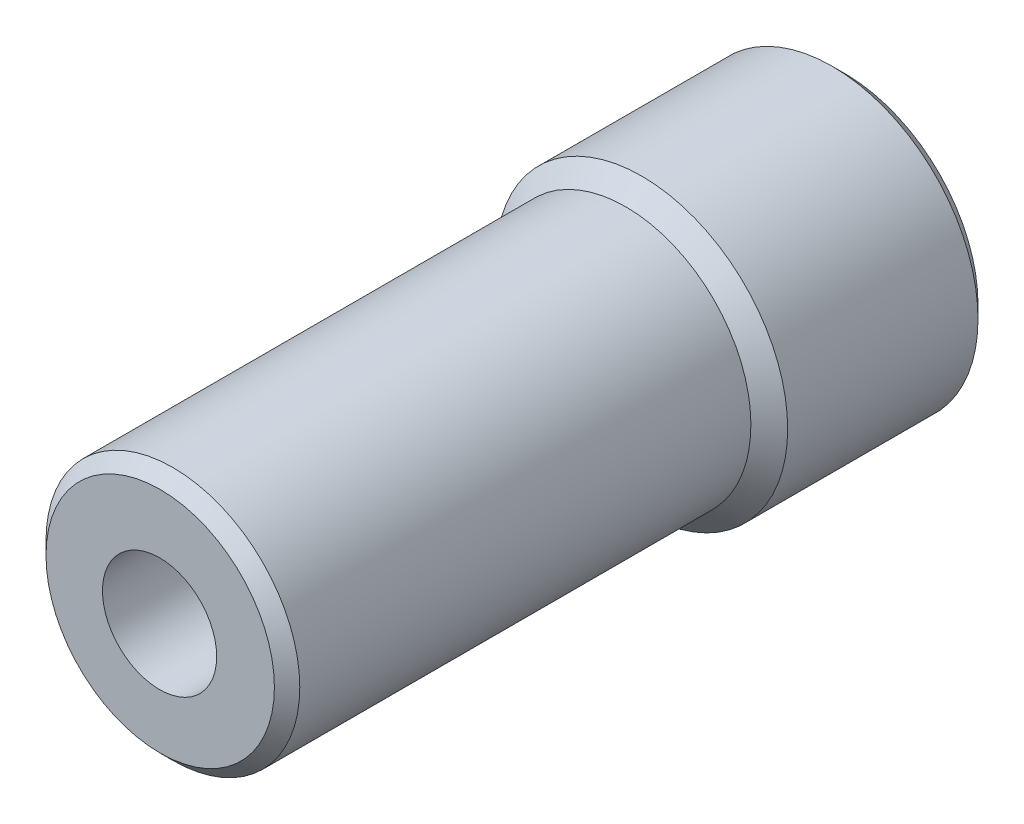
ISO-10303-21;
HEADER;
FILE_DESCRIPTION(('STEP AP214'),'2;1');
FILE_NAME('part.step','',(''),(''),'','','');
FILE_SCHEMA(('AUTOMOTIVE_DESIGN { 1 0 10303 214 1 1 1 1 }'));
ENDSEC;
DATA;
#1=APPLICATION_CONTEXT('core data for automotive mechanical design processes');
#2=APPLICATION_PROTOCOL_DEFINITION('international standard','automotive_design',2000,#1);
#3=PRODUCT_CONTEXT('',#1,'mechanical');
#4=PRODUCT('Part','Part','',(#3));
#5=PRODUCT_RELATED_PRODUCT_CATEGORY('part','',(#4));
#6=PRODUCT_DEFINITION_FORMATION('','',#4);
#7=PRODUCT_DEFINITION_CONTEXT('part definition',#1,'design');
#8=PRODUCT_DEFINITION('design','',#6,#7);
#9=PRODUCT_DEFINITION_SHAPE('','',#8);
#10=(LENGTH_UNIT() NAMED_UNIT(*) SI_UNIT(.MILLI.,.METRE.));
#11=(NAMED_UNIT(*) PLANE_ANGLE_UNIT() SI_UNIT($,.RADIAN.));
#12=(NAMED_UNIT(*) SI_UNIT($,.STERADIAN.) SOLID_ANGLE_UNIT());
#13=UNCERTAINTY_MEASURE_WITH_UNIT(LENGTH_MEASURE(1.E-05),#10,'distance_accuracy_value','');
#14=(GEOMETRIC_REPRESENTATION_CONTEXT(3) GLOBAL_UNCERTAINTY_ASSIGNED_CONTEXT((#13)) GLOBAL_UNIT_ASSIGNED_CONTEXT((#10,
#11,#12)) REPRESENTATION_CONTEXT('',''));
#15=CARTESIAN_POINT('',(0.,0.,0.));
#16=DIRECTION('',(0.,0.,1.));
#17=DIRECTION('',(1.,0.,0.));
#18=AXIS2_PLACEMENT_3D('',#15,#16,#17);
#19=CARTESIAN_POINT('',(0.,-0.0682544576997889,10.));
#20=DIRECTION('',(0.,0.,-1.));
#21=DIRECTION('',(-1.,0.,0.));
#22=AXIS2_PLACEMENT_3D('',#19,#20,#21);
#23=CYLINDRICAL_SURFACE('',#22,5.75);
#24=CARTESIAN_POINT('',(0.,-0.0682544576997889,0.500000000000009));
#25=DIRECTION('',(0.,0.,1.));
#26=DIRECTION('',(1.,0.,0.));
#27=AXIS2_PLACEMENT_3D('',#24,#25,#26);
#28=CIRCLE('',#27,5.75);
#29=CARTESIAN_POINT('',(5.75,-0.0682544576997889,0.500000000000009));
#30=VERTEX_POINT('',#29);
#31=EDGE_CURVE('E61',#30,#30,#28,.T.);
#32=ORIENTED_EDGE('',*,*,#31,.T.);
#33=EDGE_LOOP('',(#32));
#34=FACE_BOUND('',#33,.T.);
#35=CARTESIAN_POINT('',(0.,-0.0682544576997889,7.99999999999999));
#36=DIRECTION('',(0.,0.,1.));
#37=DIRECTION('',(1.,0.,0.));
#38=AXIS2_PLACEMENT_3D('',#35,#36,#37);
#39=CIRCLE('',#38,5.75);
#40=CARTESIAN_POINT('',(5.75,-0.0682544576997889,7.99999999999999));
#41=VERTEX_POINT('',#40);
#42=EDGE_CURVE('E90',#41,#41,#39,.F.);
#43=ORIENTED_EDGE('',*,*,#42,.T.);
#44=EDGE_LOOP('',(#43));
#45=FACE_BOUND('',#44,.T.);
#46=ADVANCED_FACE('F52',(#34,#45),#23,.T.);
#47=CARTESIAN_POINT('',(0.,-0.0682544576997889,0.));
#48=DIRECTION('',(0.,0.,1.));
#49=DIRECTION('',(1.,0.,0.));
#50=AXIS2_PLACEMENT_3D('',#47,#48,#49);
#51=PLANE('',#50);
#52=CARTESIAN_POINT('',(0.,-0.0682544576997889,0.));
#53=DIRECTION('',(0.,0.,1.));
#54=DIRECTION('',(1.,0.,0.));
#55=AXIS2_PLACEMENT_3D('',#52,#53,#54);
#56=CIRCLE('',#55,5.24999999999999);
#57=CARTESIAN_POINT('',(5.24999999999999,-0.0682544576997889,0.));
#58=VERTEX_POINT('',#57);
#59=EDGE_CURVE('E10',#58,#58,#56,.F.);
#60=ORIENTED_EDGE('',*,*,#59,.T.);
#61=EDGE_LOOP('',(#60));
#62=FACE_BOUND('',#61,.T.);
#63=CARTESIAN_POINT('',(0.,0.,0.));
#64=DIRECTION('',(0.,0.,-1.));
#65=DIRECTION('',(-1.,0.,0.));
#66=AXIS2_PLACEMENT_3D('',#63,#64,#65);
#67=CIRCLE('',#66,2.5);
#68=CARTESIAN_POINT('',(-2.5,0.,0.));
#69=VERTEX_POINT('',#68);
#70=EDGE_CURVE('E130',#69,#69,#67,.T.);
#71=ORIENTED_EDGE('',*,*,#70,.F.);
#72=EDGE_LOOP('',(#71));
#73=FACE_BOUND('',#72,.T.);
#74=ADVANCED_FACE('F118',(#62,#73),#51,.F.);
#75=CARTESIAN_POINT('',(0.0248752201066661,0.,27.));
#76=DIRECTION('',(0.,0.,-1.));
#77=DIRECTION('',(-1.,0.,0.));
#78=AXIS2_PLACEMENT_3D('',#75,#76,#77);
#79=CYLINDRICAL_SURFACE('',#78,5.);
#80=CARTESIAN_POINT('',(0.0248752201066661,0.,26.5));
#81=DIRECTION('',(0.,0.,1.));
#82=DIRECTION('',(1.,0.,0.));
#83=AXIS2_PLACEMENT_3D('',#80,#81,#82);
#84=CIRCLE('',#83,5.);
#85=CARTESIAN_POINT('',(5.02487522010667,0.,26.5));
#86=VERTEX_POINT('',#85);
#87=EDGE_CURVE('E68',#86,#86,#84,.F.);
#88=ORIENTED_EDGE('',*,*,#87,.T.);
#89=EDGE_LOOP('',(#88));
#90=FACE_BOUND('',#89,.T.);
#91=CARTESIAN_POINT('',(-4.97509659122163,-0.0167894586709536,8.77463722547689));
#92=CARTESIAN_POINT('',(-4.97426558216171,-0.263097965769824,8.7780120522872));
#93=CARTESIAN_POINT('',(-4.95519980123096,-0.509400106208778,8.78129907887567));
#94=CARTESIAN_POINT('',(-4.88099142621974,-0.996640213691707,8.78762474432996));
#95=CARTESIAN_POINT('',(-4.82582250819701,-1.23757413394767,8.79066320013493));
#96=CARTESIAN_POINT('',(-4.67034754283656,-1.74178397826683,8.79682629194088));
#97=CARTESIAN_POINT('',(-4.56480199576196,-2.00346302667188,8.79990339789837));
#98=CARTESIAN_POINT('',(-4.31125429318877,-2.5054142457431,8.80555364803044));
#99=CARTESIAN_POINT('',(-4.16324186462972,-2.74568121821169,8.80812667000952));
#100=CARTESIAN_POINT('',(-3.82899785990766,-3.19791989547926,8.812692412257));
#101=CARTESIAN_POINT('',(-3.6427734729016,-3.40989691035764,8.81468524151189));
#102=CARTESIAN_POINT('',(-3.23738705315629,-3.7995645119135,8.81803215236399));
#103=CARTESIAN_POINT('',(-3.01822684163031,-3.9772569931422,8.81938626926219));
#104=CARTESIAN_POINT('',(-2.55320013210684,-4.29331520481402,8.82141579137134));
#105=CARTESIAN_POINT('',(-2.3073356749734,-4.43168393764401,8.82209124840827));
#106=CARTESIAN_POINT('',(-1.79586387963108,-4.66518400360695,8.82274358519057));
#107=CARTESIAN_POINT('',(-1.53025634670667,-4.76031491024219,8.82272045804526));
#108=CARTESIAN_POINT('',(-0.986857106936146,-4.90463256766433,8.82197632096218));
#109=CARTESIAN_POINT('',(-0.709066103931216,-4.95382196884933,8.82125535128834));
#110=CARTESIAN_POINT('',(-0.149171733652034,-5.00487058024485,8.81913697295311));
#111=CARTESIAN_POINT('',(0.132931628132189,-5.00672985070596,8.81773956515282));
#112=CARTESIAN_POINT('',(0.693448329180573,-4.96306686704079,8.81430964263027));
#113=CARTESIAN_POINT('',(0.971861604639036,-4.91754379470072,8.81227711694099));
#114=CARTESIAN_POINT('',(1.51709112312577,-4.78040919551343,8.80763692812686));
#115=CARTESIAN_POINT('',(1.78390736317334,-4.68879765682051,8.80502926485418));
#116=CARTESIAN_POINT('',(2.29839144678519,-4.46207954955437,8.79931516016538));
#117=CARTESIAN_POINT('',(2.54605778128617,-4.32696955751106,8.79620867950037));
#118=CARTESIAN_POINT('',(3.01519073055738,-4.01709354186784,8.78958783794881));
#119=CARTESIAN_POINT('',(3.23665732677767,-3.84232749019089,8.78607347677348));
#120=CARTESIAN_POINT('',(3.64712860458447,-3.4580806426861,8.77873851563791));
#121=CARTESIAN_POINT('',(3.83612987831957,-3.24859620703454,8.77491788359038));
#122=CARTESIAN_POINT('',(4.17627900894536,-2.80087240232264,8.76708088528563));
#123=CARTESIAN_POINT('',(4.32742684851719,-2.56263302010628,8.76306451893885));
#124=CARTESIAN_POINT('',(4.5875911053579,-2.06414036009741,8.75495070441226));
#125=CARTESIAN_POINT('',(4.69660397986469,-1.8038852334342,8.75085324944484));
#126=CARTESIAN_POINT('',(4.86938601492586,-1.26876585966112,8.74269405901394));
#127=CARTESIAN_POINT('',(4.93315516358512,-0.993901608710351,8.73863232355984));
#128=CARTESIAN_POINT('',(5.01363999134612,-0.437358645376182,8.73065908316804));
#129=CARTESIAN_POINT('',(5.03035442111815,-0.155679752260397,8.72674758222186));
#130=CARTESIAN_POINT('',(5.0162502589587,0.406489056160449,8.7191845345419));
#131=CARTESIAN_POINT('',(4.98543167239235,0.686978971599709,8.71553298777877));
#132=CARTESIAN_POINT('',(4.87713665430119,1.23879493177218,8.70859164463336));
#133=CARTESIAN_POINT('',(4.79966214399957,1.51012135335892,8.70530183336193));
#134=CARTESIAN_POINT('',(4.60025414653651,2.0359184901085,8.6991748205948));
#135=CARTESIAN_POINT('',(4.47832068232888,2.29038921397372,8.69633761886542));
#136=CARTESIAN_POINT('',(4.19346754684805,2.7752266781282,8.69119415602358));
#137=CARTESIAN_POINT('',(4.03055155960642,3.00559558236211,8.68888784722337));
#138=CARTESIAN_POINT('',(3.66835146280358,3.43571366143873,8.68486904469479));
#139=CARTESIAN_POINT('',(3.46906736448947,3.63546284575077,8.68315655078278));
#140=CARTESIAN_POINT('',(3.03980954442973,3.9986504139556,8.68037228796258));
#141=CARTESIAN_POINT('',(2.80983885958685,4.16209238673738,8.67930045570865));
#142=CARTESIAN_POINT('',(2.3257211050865,4.44804939379749,8.67782645293081));
#143=CARTESIAN_POINT('',(2.07157406157901,4.57056447234311,8.67742428168258));
#144=CARTESIAN_POINT('',(1.54633634518542,4.7711823907143,8.67730054645108));
#145=CARTESIAN_POINT('',(1.27524679858137,4.84928817924572,8.67757893727307));
#146=CARTESIAN_POINT('',(0.723804271168122,4.95888326377515,8.67880865833074));
#147=CARTESIAN_POINT('',(0.443451281503609,4.99037251520916,8.67975998920973));
#148=CARTESIAN_POINT('',(-0.118557470405511,5.00584157440802,8.68230967541688));
#149=CARTESIAN_POINT('',(-0.400213223942635,4.9898216992601,8.68390802642662));
#150=CARTESIAN_POINT('',(-0.956835120396729,4.91072965810285,8.68770813764293));
#151=CARTESIAN_POINT('',(-1.23180125308225,4.84765742013388,8.68990989877232));
#152=CARTESIAN_POINT('',(-1.76725829835297,4.67624711714684,8.69485672431702));
#153=CARTESIAN_POINT('',(-2.02774821023362,4.56790592719961,8.69760182623241));
#154=CARTESIAN_POINT('',(-2.5268336253897,4.30903748220511,8.70355970051687));
#155=CARTESIAN_POINT('',(-2.76542965105565,4.15851123404557,8.70677246172281));
#156=CARTESIAN_POINT('',(-3.21397145114571,3.81954189180354,8.71357701546597));
#157=CARTESIAN_POINT('',(-3.4239163129284,3.63109759036917,8.71716882007061));
#158=CARTESIAN_POINT('',(-3.80922080353364,3.2216061706186,8.72463221678149));
#159=CARTESIAN_POINT('',(-3.98457510190472,3.00055403655152,8.72850385188456));
#160=CARTESIAN_POINT('',(-4.29573961869831,2.53207774668243,8.73641926246862));
#161=CARTESIAN_POINT('',(-4.43153445563773,2.28464338390281,8.7404631042083));
#162=CARTESIAN_POINT('',(-4.6595580463737,1.7705989572056,8.74860580338168));
#163=CARTESIAN_POINT('',(-4.75181899611619,1.50400323295463,8.75270461784518));
#164=CARTESIAN_POINT('',(-4.87285546981762,1.0278818244635,8.75981588151492));
#165=CARTESIAN_POINT('',(-4.91176236173264,0.820868042378023,8.76284226400991));
#166=CARTESIAN_POINT('',(-4.96323335675387,0.403637450226709,8.76881280601905));
#167=CARTESIAN_POINT('',(-4.97580581300372,0.193421677132826,8.77175699131327));
#168=CARTESIAN_POINT('',(-4.97509659122163,-0.0167894586709536,8.77463722547689));
#169=B_SPLINE_CURVE_WITH_KNOTS('',3,(#91,#92,#93,#94,#95,#96,#97,#98,#99,#100,#101,#102,#103,
#104,#105,#106,#107,#108,#109,#110,#111,#112,#113,#114,#115,#116,#117,#118,#119,#120,#121,#122,
#123,#124,#125,#126,#127,#128,#129,#130,#131,#132,#133,#134,#135,#136,#137,#138,#139,#140,#141,
#142,#143,#144,#145,#146,#147,#148,#149,#150,#151,#152,#153,#154,#155,#156,#157,#158,#159,#160,
#161,#162,#163,#164,#165,#166,#167,#168),.UNSPECIFIED.,.T.,.F.,(4,2,2,2,2,2,2,2,2,2,2,2,2,2,2,2,
2,2,2,2,2,2,2,2,2,2,2,2,2,2,2,2,2,2,2,2,2,2,4),(0.,0.738409674855132,1.47735834839618,
2.31979997187079,3.16244556043248,4.00493275967483,4.84737339003011,5.68974968235235,
6.5321342836896,7.37447028425786,8.21680521254442,9.05915468678725,9.90150437753147,
10.7439203801557,11.586336979224,12.4288419519278,13.2713473100974,14.1139234917996,
14.956499895025,15.7990986689249,16.6416973477193,17.484261331896,18.3268248810645,
19.16931271693,20.0118002922506,20.854204552411,21.6966079014085,22.5389553096366,
23.3813035231231,24.2236461145897,25.0659899942978,25.9083920308625,26.750773962393,
27.5931827205224,28.4357211937136,29.2785868262386,30.1208281277778,30.7512212755137,
31.3814144355798),.UNSPECIFIED.);
#170=CARTESIAN_POINT('',(-4.97509659122163,-0.0167894586709536,8.77463722547689));
#171=VERTEX_POINT('',#170);
#172=EDGE_CURVE('E82',#171,#171,#169,.T.);
#173=ORIENTED_EDGE('',*,*,#172,.T.);
#174=EDGE_LOOP('',(#173));
#175=FACE_BOUND('',#174,.T.);
#176=ADVANCED_FACE('F92',(#90,#175),#79,.T.);
#177=CARTESIAN_POINT('',(0.0248752201066661,0.,27.));
#178=DIRECTION('',(0.,0.,1.));
#179=DIRECTION('',(1.,0.,0.));
#180=AXIS2_PLACEMENT_3D('',#177,#178,#179);
#181=PLANE('',#180);
#182=CARTESIAN_POINT('',(0.0248752201066661,0.,27.));
#183=DIRECTION('',(0.,0.,1.));
#184=DIRECTION('',(1.,0.,0.));
#185=AXIS2_PLACEMENT_3D('',#182,#183,#184);
#186=CIRCLE('',#185,4.5);
#187=CARTESIAN_POINT('',(4.52487522010666,0.,27.));
#188=VERTEX_POINT('',#187);
#189=EDGE_CURVE('E76',#188,#188,#186,.T.);
#190=ORIENTED_EDGE('',*,*,#189,.T.);
#191=EDGE_LOOP('',(#190));
#192=FACE_BOUND('',#191,.T.);
#193=CARTESIAN_POINT('',(0.,-0.093129677806359,27.));
#194=DIRECTION('',(0.,0.,1.));
#195=DIRECTION('',(1.,0.,0.));
#196=AXIS2_PLACEMENT_3D('',#193,#194,#195);
#197=CIRCLE('',#196,2.25);
#198=CARTESIAN_POINT('',(2.25,-0.093129677806359,27.));
#199=VERTEX_POINT('',#198);
#200=EDGE_CURVE('E139',#199,#199,#197,.T.);
#201=ORIENTED_EDGE('',*,*,#200,.F.);
#202=EDGE_LOOP('',(#201));
#203=FACE_BOUND('',#202,.T.);
#204=ADVANCED_FACE('F150',(#192,#203),#181,.T.);
#205=CARTESIAN_POINT('',(0.,0.,10.7));
#206=DIRECTION('',(0.,0.,-1.));
#207=DIRECTION('',(-1.,0.,0.));
#208=AXIS2_PLACEMENT_3D('',#205,#206,#207);
#209=CYLINDRICAL_SURFACE('',#208,2.5);
#210=CARTESIAN_POINT('',(0.,0.,10.7));
#211=DIRECTION('',(0.,0.,-1.));
#212=DIRECTION('',(-1.,0.,0.));
#213=AXIS2_PLACEMENT_3D('',#210,#211,#212);
#214=CIRCLE('',#213,2.5);
#215=CARTESIAN_POINT('',(-2.5,0.,10.7));
#216=VERTEX_POINT('',#215);
#217=EDGE_CURVE('E125',#216,#216,#214,.T.);
#218=ORIENTED_EDGE('',*,*,#217,.F.);
#219=EDGE_LOOP('',(#218));
#220=FACE_BOUND('',#219,.T.);
#221=ORIENTED_EDGE('',*,*,#70,.T.);
#222=EDGE_LOOP('',(#221));
#223=FACE_BOUND('',#222,.T.);
#224=ADVANCED_FACE('F152',(#220,#223),#209,.F.);
#225=CARTESIAN_POINT('',(0.,0.,10.7));
#226=DIRECTION('',(0.,0.,-1.));
#227=DIRECTION('',(-1.,0.,0.));
#228=AXIS2_PLACEMENT_3D('',#225,#226,#227);
#229=PLANE('',#228);
#230=CARTESIAN_POINT('',(0.,-0.093129677806359,10.7));
#231=DIRECTION('',(0.,0.,-1.));
#232=DIRECTION('',(-1.,0.,0.));
#233=AXIS2_PLACEMENT_3D('',#230,#231,#232);
#234=CIRCLE('',#233,2.25);
#235=CARTESIAN_POINT('',(-2.25,-0.093129677806359,10.7));
#236=VERTEX_POINT('',#235);
#237=EDGE_CURVE('E136',#236,#236,#234,.T.);
#238=ORIENTED_EDGE('',*,*,#237,.F.);
#239=EDGE_LOOP('',(#238));
#240=FACE_BOUND('',#239,.T.);
#241=ORIENTED_EDGE('',*,*,#217,.T.);
#242=EDGE_LOOP('',(#241));
#243=FACE_BOUND('',#242,.T.);
#244=ADVANCED_FACE('F158',(#240,#243),#229,.T.);
#245=CARTESIAN_POINT('',(0.,-0.093129677806359,9.3));
#246=DIRECTION('',(0.,0.,1.));
#247=DIRECTION('',(1.,0.,0.));
#248=AXIS2_PLACEMENT_3D('',#245,#246,#247);
#249=CYLINDRICAL_SURFACE('',#248,2.25);
#250=ORIENTED_EDGE('',*,*,#237,.T.);
#251=EDGE_LOOP('',(#250));
#252=FACE_BOUND('',#251,.T.);
#253=ORIENTED_EDGE('',*,*,#200,.T.);
#254=EDGE_LOOP('',(#253));
#255=FACE_BOUND('',#254,.T.);
#256=ADVANCED_FACE('F105',(#252,#255),#249,.F.);
#257=CARTESIAN_POINT('',(0.,-0.0682544576997889,10.));
#258=DIRECTION('',(0.,0.,-1.));
#259=DIRECTION('',(-1.,0.,0.));
#260=AXIS2_PLACEMENT_3D('',#257,#258,#259);
#261=CONICAL_SURFACE('',#260,3.74999999999996,0.785398163397454);
#262=ORIENTED_EDGE('',*,*,#42,.F.);
#263=EDGE_LOOP('',(#262));
#264=FACE_BOUND('',#263,.T.);
#265=ORIENTED_EDGE('',*,*,#172,.F.);
#266=EDGE_LOOP('',(#265));
#267=FACE_BOUND('',#266,.T.);
#268=ADVANCED_FACE('F97',(#264,#267),#261,.T.);
#269=CARTESIAN_POINT('',(0.0248752201066661,0.,27.));
#270=DIRECTION('',(0.,0.,-1.));
#271=DIRECTION('',(-1.,0.,0.));
#272=AXIS2_PLACEMENT_3D('',#269,#270,#271);
#273=CONICAL_SURFACE('',#272,4.5,0.785398163397444);
#274=ORIENTED_EDGE('',*,*,#87,.F.);
#275=EDGE_LOOP('',(#274));
#276=FACE_BOUND('',#275,.T.);
#277=ORIENTED_EDGE('',*,*,#189,.F.);
#278=EDGE_LOOP('',(#277));
#279=FACE_BOUND('',#278,.T.);
#280=ADVANCED_FACE('F104',(#276,#279),#273,.T.);
#281=CARTESIAN_POINT('',(0.,-0.0682544576997889,0.500000000000009));
#282=DIRECTION('',(0.,0.,1.));
#283=DIRECTION('',(1.,0.,0.));
#284=AXIS2_PLACEMENT_3D('',#281,#282,#283);
#285=CONICAL_SURFACE('',#284,5.75,0.785398163397448);
#286=ORIENTED_EDGE('',*,*,#59,.F.);
#287=EDGE_LOOP('',(#286));
#288=FACE_BOUND('',#287,.T.);
#289=ORIENTED_EDGE('',*,*,#31,.F.);
#290=EDGE_LOOP('',(#289));
#291=FACE_BOUND('',#290,.T.);
#292=ADVANCED_FACE('F55',(#288,#291),#285,.T.);
#293=CLOSED_SHELL('',(#46,#74,#176,#204,#224,#244,#256,#268,#280,#292));
#294=MANIFOLD_SOLID_BREP('B2',#293);
#295=ADVANCED_BREP_SHAPE_REPRESENTATION('',(#18,#294),#14);
#296=SHAPE_DEFINITION_REPRESENTATION(#9,#295);
ENDSEC;
END-ISO-10303-21;
